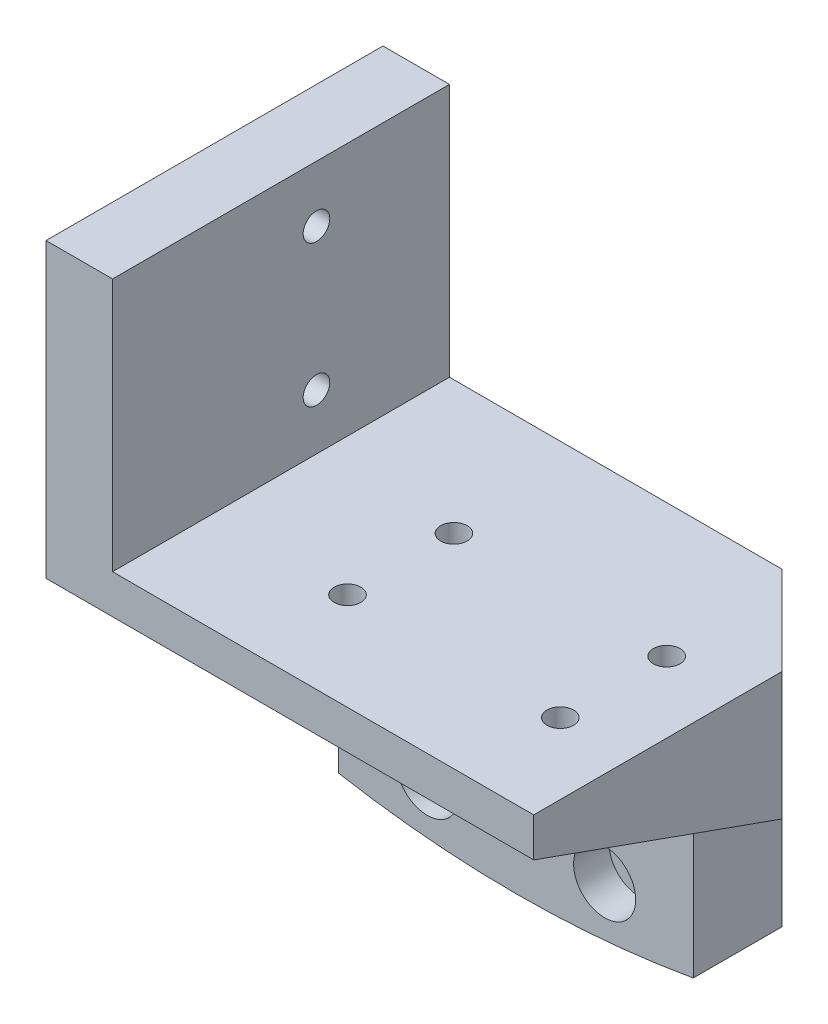
ISO-10303-21;
HEADER;
FILE_DESCRIPTION(('STEP AP214'),'2;1');
FILE_NAME('part.step','',(''),(''),'','','');
FILE_SCHEMA(('AUTOMOTIVE_DESIGN { 1 0 10303 214 1 1 1 1 }'));
ENDSEC;
DATA;
#1=APPLICATION_CONTEXT('core data for automotive mechanical design processes');
#2=APPLICATION_PROTOCOL_DEFINITION('international standard','automotive_design',2000,#1);
#3=PRODUCT_CONTEXT('',#1,'mechanical');
#4=PRODUCT('Part','Part','',(#3));
#5=PRODUCT_RELATED_PRODUCT_CATEGORY('part','',(#4));
#6=PRODUCT_DEFINITION_FORMATION('','',#4);
#7=PRODUCT_DEFINITION_CONTEXT('part definition',#1,'design');
#8=PRODUCT_DEFINITION('design','',#6,#7);
#9=PRODUCT_DEFINITION_SHAPE('','',#8);
#10=(LENGTH_UNIT() NAMED_UNIT(*) SI_UNIT(.MILLI.,.METRE.));
#11=(NAMED_UNIT(*) PLANE_ANGLE_UNIT() SI_UNIT($,.RADIAN.));
#12=(NAMED_UNIT(*) SI_UNIT($,.STERADIAN.) SOLID_ANGLE_UNIT());
#13=UNCERTAINTY_MEASURE_WITH_UNIT(LENGTH_MEASURE(1.E-05),#10,'distance_accuracy_value','');
#14=(GEOMETRIC_REPRESENTATION_CONTEXT(3) GLOBAL_UNCERTAINTY_ASSIGNED_CONTEXT((#13)) GLOBAL_UNIT_ASSIGNED_CONTEXT((#10,
#11,#12)) REPRESENTATION_CONTEXT('',''));
#15=CARTESIAN_POINT('',(0.,0.,0.));
#16=DIRECTION('',(0.,0.,1.));
#17=DIRECTION('',(1.,0.,0.));
#18=AXIS2_PLACEMENT_3D('',#15,#16,#17);
#19=CARTESIAN_POINT('',(-20.,-112.231902772786,10.));
#20=DIRECTION('',(1.,0.,0.));
#21=DIRECTION('',(0.,1.,0.));
#22=AXIS2_PLACEMENT_3D('',#19,#20,#21);
#23=PLANE('',#22);
#24=DIRECTION('',(0.,-1.,0.));
#25=VECTOR('',#24,1.);
#26=CARTESIAN_POINT('',(-20.,-112.231902772786,10.));
#27=LINE('',#26,#25);
#28=CARTESIAN_POINT('',(-20.,-96.7,10.));
#29=VERTEX_POINT('',#28);
#30=CARTESIAN_POINT('',(-20.,-112.231902772786,10.));
#31=VERTEX_POINT('',#30);
#32=EDGE_CURVE('E211',#29,#31,#27,.T.);
#33=ORIENTED_EDGE('',*,*,#32,.F.);
#34=DIRECTION('',(0.,0.,-1.));
#35=VECTOR('',#34,1.);
#36=CARTESIAN_POINT('',(-20.,-96.7,0.));
#37=LINE('',#36,#35);
#38=CARTESIAN_POINT('',(-20.,-96.7,0.));
#39=VERTEX_POINT('',#38);
#40=EDGE_CURVE('E268',#29,#39,#37,.T.);
#41=ORIENTED_EDGE('',*,*,#40,.T.);
#42=DIRECTION('',(0.,-1.,0.));
#43=VECTOR('',#42,1.);
#44=CARTESIAN_POINT('',(-20.,-112.231902772786,0.));
#45=LINE('',#44,#43);
#46=CARTESIAN_POINT('',(-20.,-112.231902772786,0.));
#47=VERTEX_POINT('',#46);
#48=EDGE_CURVE('E206',#39,#47,#45,.T.);
#49=ORIENTED_EDGE('',*,*,#48,.T.);
#50=DIRECTION('',(0.,0.,-1.));
#51=VECTOR('',#50,1.);
#52=CARTESIAN_POINT('',(-20.,-112.231902772786,10.));
#53=LINE('',#52,#51);
#54=EDGE_CURVE('E213',#31,#47,#53,.T.);
#55=ORIENTED_EDGE('',*,*,#54,.F.);
#56=EDGE_LOOP('',(#33,#41,#49,#55));
#57=FACE_BOUND('',#56,.T.);
#58=ADVANCED_FACE('F43',(#57),#23,.F.);
#59=CARTESIAN_POINT('',(-9.99999999999998,-97.85,-0.000999999999999265));
#60=DIRECTION('',(0.,0.,1.));
#61=DIRECTION('',(1.,0.,0.));
#62=AXIS2_PLACEMENT_3D('',#59,#60,#61);
#63=CYLINDRICAL_SURFACE('',#62,1.75);
#64=CARTESIAN_POINT('',(-9.99999999999998,-97.85,0.));
#65=DIRECTION('',(0.,0.,-1.));
#66=DIRECTION('',(-1.,0.,0.));
#67=AXIS2_PLACEMENT_3D('',#64,#65,#66);
#68=CIRCLE('',#67,1.75);
#69=CARTESIAN_POINT('',(-11.75,-97.85,0.));
#70=VERTEX_POINT('',#69);
#71=EDGE_CURVE('E196',#70,#70,#68,.F.);
#72=ORIENTED_EDGE('',*,*,#71,.F.);
#73=EDGE_LOOP('',(#72));
#74=FACE_BOUND('',#73,.T.);
#75=CARTESIAN_POINT('',(-9.99999999999998,-97.85,6.));
#76=DIRECTION('',(0.,0.,1.));
#77=DIRECTION('',(1.,0.,0.));
#78=AXIS2_PLACEMENT_3D('',#75,#76,#77);
#79=CIRCLE('',#78,1.75);
#80=CARTESIAN_POINT('',(-8.24999999999998,-97.85,6.));
#81=VERTEX_POINT('',#80);
#82=EDGE_CURVE('E192',#81,#81,#79,.F.);
#83=ORIENTED_EDGE('',*,*,#82,.F.);
#84=EDGE_LOOP('',(#83));
#85=FACE_BOUND('',#84,.T.);
#86=ADVANCED_FACE('F364',(#74,#85),#63,.F.);
#87=CARTESIAN_POINT('',(10.,-107.85,-0.000999999999999265));
#88=DIRECTION('',(0.,0.,1.));
#89=DIRECTION('',(1.,0.,0.));
#90=AXIS2_PLACEMENT_3D('',#87,#88,#89);
#91=CYLINDRICAL_SURFACE('',#90,1.75);
#92=CARTESIAN_POINT('',(10.,-107.85,0.));
#93=DIRECTION('',(0.,0.,-1.));
#94=DIRECTION('',(-1.,0.,0.));
#95=AXIS2_PLACEMENT_3D('',#92,#93,#94);
#96=CIRCLE('',#95,1.75);
#97=CARTESIAN_POINT('',(8.25000000000002,-107.85,0.));
#98=VERTEX_POINT('',#97);
#99=EDGE_CURVE('E188',#98,#98,#96,.F.);
#100=ORIENTED_EDGE('',*,*,#99,.F.);
#101=EDGE_LOOP('',(#100));
#102=FACE_BOUND('',#101,.T.);
#103=CARTESIAN_POINT('',(10.,-107.85,6.));
#104=DIRECTION('',(0.,0.,1.));
#105=DIRECTION('',(1.,0.,0.));
#106=AXIS2_PLACEMENT_3D('',#103,#104,#105);
#107=CIRCLE('',#106,1.75);
#108=CARTESIAN_POINT('',(11.75,-107.85,6.));
#109=VERTEX_POINT('',#108);
#110=EDGE_CURVE('E234',#109,#109,#107,.F.);
#111=ORIENTED_EDGE('',*,*,#110,.F.);
#112=EDGE_LOOP('',(#111));
#113=FACE_BOUND('',#112,.T.);
#114=ADVANCED_FACE('F370',(#102,#113),#91,.F.);
#115=CARTESIAN_POINT('',(9.99999999999999,-97.85,-0.000999999999999265));
#116=DIRECTION('',(0.,0.,1.));
#117=DIRECTION('',(1.,0.,0.));
#118=AXIS2_PLACEMENT_3D('',#115,#116,#117);
#119=CYLINDRICAL_SURFACE('',#118,1.75);
#120=CARTESIAN_POINT('',(9.99999999999999,-97.85,0.));
#121=DIRECTION('',(0.,0.,-1.));
#122=DIRECTION('',(-1.,0.,0.));
#123=AXIS2_PLACEMENT_3D('',#120,#121,#122);
#124=CIRCLE('',#123,1.75);
#125=CARTESIAN_POINT('',(8.24999999999999,-97.85,0.));
#126=VERTEX_POINT('',#125);
#127=EDGE_CURVE('E191',#126,#126,#124,.F.);
#128=ORIENTED_EDGE('',*,*,#127,.F.);
#129=EDGE_LOOP('',(#128));
#130=FACE_BOUND('',#129,.T.);
#131=CARTESIAN_POINT('',(9.99999999999999,-97.85,6.));
#132=DIRECTION('',(0.,0.,1.));
#133=DIRECTION('',(1.,0.,0.));
#134=AXIS2_PLACEMENT_3D('',#131,#132,#133);
#135=CIRCLE('',#134,1.75);
#136=CARTESIAN_POINT('',(11.75,-97.85,6.));
#137=VERTEX_POINT('',#136);
#138=EDGE_CURVE('E231',#137,#137,#135,.F.);
#139=ORIENTED_EDGE('',*,*,#138,.F.);
#140=EDGE_LOOP('',(#139));
#141=FACE_BOUND('',#140,.T.);
#142=ADVANCED_FACE('F508',(#130,#141),#119,.F.);
#143=CARTESIAN_POINT('',(-9.99999999999998,-107.85,-0.000999999999999265));
#144=DIRECTION('',(0.,0.,1.));
#145=DIRECTION('',(1.,0.,0.));
#146=AXIS2_PLACEMENT_3D('',#143,#144,#145);
#147=CYLINDRICAL_SURFACE('',#146,1.75);
#148=CARTESIAN_POINT('',(-9.99999999999998,-107.85,0.));
#149=DIRECTION('',(0.,0.,-1.));
#150=DIRECTION('',(-1.,0.,0.));
#151=AXIS2_PLACEMENT_3D('',#148,#149,#150);
#152=CIRCLE('',#151,1.75);
#153=CARTESIAN_POINT('',(-11.75,-107.85,0.));
#154=VERTEX_POINT('',#153);
#155=EDGE_CURVE('E193',#154,#154,#152,.F.);
#156=ORIENTED_EDGE('',*,*,#155,.F.);
#157=EDGE_LOOP('',(#156));
#158=FACE_BOUND('',#157,.T.);
#159=CARTESIAN_POINT('',(-9.99999999999998,-107.85,6.));
#160=DIRECTION('',(0.,0.,1.));
#161=DIRECTION('',(1.,0.,0.));
#162=AXIS2_PLACEMENT_3D('',#159,#160,#161);
#163=CIRCLE('',#162,1.75);
#164=CARTESIAN_POINT('',(-8.24999999999998,-107.85,6.));
#165=VERTEX_POINT('',#164);
#166=EDGE_CURVE('E185',#165,#165,#163,.F.);
#167=ORIENTED_EDGE('',*,*,#166,.F.);
#168=EDGE_LOOP('',(#167));
#169=FACE_BOUND('',#168,.T.);
#170=ADVANCED_FACE('F385',(#158,#169),#147,.F.);
#171=CARTESIAN_POINT('',(0.,0.,10.));
#172=DIRECTION('',(0.,0.,-1.));
#173=DIRECTION('',(-1.,0.,0.));
#174=AXIS2_PLACEMENT_3D('',#171,#172,#173);
#175=CYLINDRICAL_SURFACE('',#174,114.);
#176=CARTESIAN_POINT('',(0.,0.,0.));
#177=DIRECTION('',(0.,0.,1.));
#178=DIRECTION('',(-1.,0.,0.));
#179=AXIS2_PLACEMENT_3D('',#176,#177,#178);
#180=CIRCLE('',#179,114.);
#181=CARTESIAN_POINT('',(20.,-112.231902772786,0.));
#182=VERTEX_POINT('',#181);
#183=EDGE_CURVE('E201',#47,#182,#180,.T.);
#184=ORIENTED_EDGE('',*,*,#183,.T.);
#185=DIRECTION('',(0.,0.,-1.));
#186=VECTOR('',#185,1.);
#187=CARTESIAN_POINT('',(20.,-112.231902772786,10.));
#188=LINE('',#187,#186);
#189=CARTESIAN_POINT('',(20.,-112.231902772786,10.));
#190=VERTEX_POINT('',#189);
#191=EDGE_CURVE('E225',#190,#182,#188,.T.);
#192=ORIENTED_EDGE('',*,*,#191,.F.);
#193=CARTESIAN_POINT('',(0.,0.,10.));
#194=DIRECTION('',(0.,0.,1.));
#195=DIRECTION('',(-1.,0.,0.));
#196=AXIS2_PLACEMENT_3D('',#193,#194,#195);
#197=CIRCLE('',#196,114.);
#198=EDGE_CURVE('E202',#31,#190,#197,.T.);
#199=ORIENTED_EDGE('',*,*,#198,.F.);
#200=ORIENTED_EDGE('',*,*,#54,.T.);
#201=EDGE_LOOP('',(#184,#192,#199,#200));
#202=FACE_BOUND('',#201,.T.);
#203=ADVANCED_FACE('F381',(#202),#175,.T.);
#204=CARTESIAN_POINT('',(20.,-91.7,10.));
#205=DIRECTION('',(-1.,0.,0.));
#206=DIRECTION('',(0.,-1.,0.));
#207=AXIS2_PLACEMENT_3D('',#204,#205,#206);
#208=PLANE('',#207);
#209=DIRECTION('',(0.,1.,0.));
#210=VECTOR('',#209,1.);
#211=CARTESIAN_POINT('',(20.,-91.7,0.));
#212=LINE('',#211,#210);
#213=CARTESIAN_POINT('',(20.,-91.7,0.));
#214=VERTEX_POINT('',#213);
#215=EDGE_CURVE('E216',#182,#214,#212,.T.);
#216=ORIENTED_EDGE('',*,*,#215,.T.);
#217=DIRECTION('',(0.,0.,-1.));
#218=VECTOR('',#217,1.);
#219=CARTESIAN_POINT('',(20.,-91.7,10.));
#220=LINE('',#219,#218);
#221=CARTESIAN_POINT('',(20.,-91.7,10.));
#222=VERTEX_POINT('',#221);
#223=EDGE_CURVE('E222',#222,#214,#220,.T.);
#224=ORIENTED_EDGE('',*,*,#223,.F.);
#225=DIRECTION('',(0.,1.,0.));
#226=VECTOR('',#225,1.);
#227=CARTESIAN_POINT('',(20.,-91.7,10.));
#228=LINE('',#227,#226);
#229=EDGE_CURVE('E205',#190,#222,#228,.T.);
#230=ORIENTED_EDGE('',*,*,#229,.F.);
#231=ORIENTED_EDGE('',*,*,#191,.T.);
#232=EDGE_LOOP('',(#216,#224,#230,#231));
#233=FACE_BOUND('',#232,.T.);
#234=ADVANCED_FACE('F377',(#233),#208,.F.);
#235=CARTESIAN_POINT('',(0.,0.,10.));
#236=DIRECTION('',(0.,0.,-1.));
#237=DIRECTION('',(-1.,0.,0.));
#238=AXIS2_PLACEMENT_3D('',#235,#236,#237);
#239=PLANE('',#238);
#240=CARTESIAN_POINT('',(-9.99999999999998,-107.85,10.));
#241=DIRECTION('',(0.,0.,1.));
#242=DIRECTION('',(1.,0.,0.));
#243=AXIS2_PLACEMENT_3D('',#240,#241,#242);
#244=CIRCLE('',#243,3.5);
#245=CARTESIAN_POINT('',(-6.49999999999998,-107.85,10.));
#246=VERTEX_POINT('',#245);
#247=EDGE_CURVE('E163',#246,#246,#244,.T.);
#248=ORIENTED_EDGE('',*,*,#247,.F.);
#249=EDGE_LOOP('',(#248));
#250=FACE_BOUND('',#249,.T.);
#251=CARTESIAN_POINT('',(10.,-107.85,10.));
#252=DIRECTION('',(0.,0.,1.));
#253=DIRECTION('',(1.,0.,0.));
#254=AXIS2_PLACEMENT_3D('',#251,#252,#253);
#255=CIRCLE('',#254,3.5);
#256=CARTESIAN_POINT('',(13.5,-107.85,10.));
#257=VERTEX_POINT('',#256);
#258=EDGE_CURVE('E174',#257,#257,#255,.T.);
#259=ORIENTED_EDGE('',*,*,#258,.F.);
#260=EDGE_LOOP('',(#259));
#261=FACE_BOUND('',#260,.T.);
#262=CARTESIAN_POINT('',(9.99999999999999,-97.85,10.));
#263=DIRECTION('',(0.,0.,1.));
#264=DIRECTION('',(1.,0.,0.));
#265=AXIS2_PLACEMENT_3D('',#262,#263,#264);
#266=CIRCLE('',#265,3.5);
#267=CARTESIAN_POINT('',(13.5,-97.85,10.));
#268=VERTEX_POINT('',#267);
#269=EDGE_CURVE('E168',#268,#268,#266,.T.);
#270=ORIENTED_EDGE('',*,*,#269,.F.);
#271=EDGE_LOOP('',(#270));
#272=FACE_BOUND('',#271,.T.);
#273=CARTESIAN_POINT('',(-9.99999999999998,-97.85,10.));
#274=DIRECTION('',(0.,0.,1.));
#275=DIRECTION('',(1.,0.,0.));
#276=AXIS2_PLACEMENT_3D('',#273,#274,#275);
#277=CIRCLE('',#276,3.5);
#278=CARTESIAN_POINT('',(-6.49999999999998,-97.85,10.));
#279=VERTEX_POINT('',#278);
#280=EDGE_CURVE('E167',#279,#279,#277,.T.);
#281=ORIENTED_EDGE('',*,*,#280,.F.);
#282=EDGE_LOOP('',(#281));
#283=FACE_BOUND('',#282,.T.);
#284=ORIENTED_EDGE('',*,*,#198,.T.);
#285=ORIENTED_EDGE('',*,*,#229,.T.);
#286=DIRECTION('',(-1.,0.,0.));
#287=VECTOR('',#286,1.);
#288=CARTESIAN_POINT('',(-20.,-91.7,10.));
#289=LINE('',#288,#287);
#290=CARTESIAN_POINT('',(-25.,-91.7,10.));
#291=VERTEX_POINT('',#290);
#292=EDGE_CURVE('E209',#222,#291,#289,.T.);
#293=ORIENTED_EDGE('',*,*,#292,.T.);
#294=DIRECTION('',(-0.70710678118655,0.707106781186545,0.));
#295=VECTOR('',#294,1.);
#296=CARTESIAN_POINT('',(-58.3499999999999,-58.3500000000004,10.));
#297=LINE('',#296,#295);
#298=EDGE_CURVE('E54',#291,#29,#297,.F.);
#299=ORIENTED_EDGE('',*,*,#298,.T.);
#300=ORIENTED_EDGE('',*,*,#32,.T.);
#301=EDGE_LOOP('',(#284,#285,#293,#299,#300));
#302=FACE_BOUND('',#301,.T.);
#303=ADVANCED_FACE('F380',(#250,#261,#272,#283,#302),#239,.F.);
#304=CARTESIAN_POINT('',(0.,0.,0.));
#305=DIRECTION('',(0.,0.,-1.));
#306=DIRECTION('',(-1.,0.,0.));
#307=AXIS2_PLACEMENT_3D('',#304,#305,#306);
#308=PLANE('',#307);
#309=ORIENTED_EDGE('',*,*,#155,.T.);
#310=EDGE_LOOP('',(#309));
#311=FACE_BOUND('',#310,.T.);
#312=ORIENTED_EDGE('',*,*,#127,.T.);
#313=EDGE_LOOP('',(#312));
#314=FACE_BOUND('',#313,.T.);
#315=ORIENTED_EDGE('',*,*,#99,.T.);
#316=EDGE_LOOP('',(#315));
#317=FACE_BOUND('',#316,.T.);
#318=ORIENTED_EDGE('',*,*,#71,.T.);
#319=EDGE_LOOP('',(#318));
#320=FACE_BOUND('',#319,.T.);
#321=DIRECTION('',(-1.,0.,0.));
#322=VECTOR('',#321,1.);
#323=CARTESIAN_POINT('',(-20.,-77.3,0.));
#324=LINE('',#323,#322);
#325=CARTESIAN_POINT('',(20.,-77.3,0.));
#326=VERTEX_POINT('',#325);
#327=CARTESIAN_POINT('',(-17.5,-77.3,0.));
#328=VERTEX_POINT('',#327);
#329=EDGE_CURVE('E144',#326,#328,#324,.T.);
#330=ORIENTED_EDGE('',*,*,#329,.F.);
#331=DIRECTION('',(0.,-1.,0.));
#332=VECTOR('',#331,1.);
#333=CARTESIAN_POINT('',(20.,-91.7,0.));
#334=LINE('',#333,#332);
#335=EDGE_CURVE('E228',#326,#214,#334,.T.);
#336=ORIENTED_EDGE('',*,*,#335,.T.);
#337=ORIENTED_EDGE('',*,*,#215,.F.);
#338=ORIENTED_EDGE('',*,*,#183,.F.);
#339=ORIENTED_EDGE('',*,*,#48,.F.);
#340=DIRECTION('',(0.70710678118655,-0.707106781186545,0.));
#341=VECTOR('',#340,1.);
#342=CARTESIAN_POINT('',(-25.,-91.7,0.));
#343=LINE('',#342,#341);
#344=CARTESIAN_POINT('',(-25.,-91.7,0.));
#345=VERTEX_POINT('',#344);
#346=EDGE_CURVE('E12',#39,#345,#343,.F.);
#347=ORIENTED_EDGE('',*,*,#346,.T.);
#348=DIRECTION('',(0.,-1.,0.));
#349=VECTOR('',#348,1.);
#350=CARTESIAN_POINT('',(-25.,-91.7,0.));
#351=LINE('',#350,#349);
#352=CARTESIAN_POINT('',(-25.,-48.7,0.));
#353=VERTEX_POINT('',#352);
#354=EDGE_CURVE('E320',#353,#345,#351,.T.);
#355=ORIENTED_EDGE('',*,*,#354,.F.);
#356=DIRECTION('',(1.,0.,0.));
#357=VECTOR('',#356,1.);
#358=CARTESIAN_POINT('',(-25.,-48.7,0.));
#359=LINE('',#358,#357);
#360=CARTESIAN_POINT('',(-17.5,-48.7,0.));
#361=VERTEX_POINT('',#360);
#362=EDGE_CURVE('E326',#353,#361,#359,.T.);
#363=ORIENTED_EDGE('',*,*,#362,.T.);
#364=DIRECTION('',(0.,1.,0.));
#365=VECTOR('',#364,1.);
#366=CARTESIAN_POINT('',(-17.5,-77.3,0.));
#367=LINE('',#366,#365);
#368=EDGE_CURVE('E145',#328,#361,#367,.T.);
#369=ORIENTED_EDGE('',*,*,#368,.F.);
#370=EDGE_LOOP('',(#330,#336,#337,#338,#339,#347,#355,#363,#369));
#371=FACE_BOUND('',#370,.T.);
#372=ADVANCED_FACE('F375',(#311,#314,#317,#320,#371),#308,.T.);
#373=CARTESIAN_POINT('',(-9.99999999999998,-107.85,6.));
#374=DIRECTION('',(0.,0.,1.));
#375=DIRECTION('',(1.,0.,0.));
#376=AXIS2_PLACEMENT_3D('',#373,#374,#375);
#377=PLANE('',#376);
#378=CARTESIAN_POINT('',(-9.99999999999998,-107.85,6.));
#379=DIRECTION('',(0.,0.,1.));
#380=DIRECTION('',(1.,0.,0.));
#381=AXIS2_PLACEMENT_3D('',#378,#379,#380);
#382=CIRCLE('',#381,3.5);
#383=CARTESIAN_POINT('',(-6.49999999999998,-107.85,6.));
#384=VERTEX_POINT('',#383);
#385=EDGE_CURVE('E177',#384,#384,#382,.T.);
#386=ORIENTED_EDGE('',*,*,#385,.T.);
#387=EDGE_LOOP('',(#386));
#388=FACE_BOUND('',#387,.T.);
#389=ORIENTED_EDGE('',*,*,#166,.T.);
#390=EDGE_LOOP('',(#389));
#391=FACE_BOUND('',#390,.T.);
#392=ADVANCED_FACE('F493',(#388,#391),#377,.T.);
#393=CARTESIAN_POINT('',(-9.99999999999998,-107.85,6.));
#394=DIRECTION('',(0.,0.,1.));
#395=DIRECTION('',(1.,0.,0.));
#396=AXIS2_PLACEMENT_3D('',#393,#394,#395);
#397=CYLINDRICAL_SURFACE('',#396,3.5);
#398=ORIENTED_EDGE('',*,*,#385,.F.);
#399=EDGE_LOOP('',(#398));
#400=FACE_BOUND('',#399,.T.);
#401=ORIENTED_EDGE('',*,*,#247,.T.);
#402=EDGE_LOOP('',(#401));
#403=FACE_BOUND('',#402,.T.);
#404=ADVANCED_FACE('F479',(#400,#403),#397,.F.);
#405=CARTESIAN_POINT('',(9.99999999999999,-97.85,6.));
#406=DIRECTION('',(0.,0.,1.));
#407=DIRECTION('',(1.,0.,0.));
#408=AXIS2_PLACEMENT_3D('',#405,#406,#407);
#409=PLANE('',#408);
#410=CARTESIAN_POINT('',(9.99999999999999,-97.85,6.));
#411=DIRECTION('',(0.,0.,1.));
#412=DIRECTION('',(1.,0.,0.));
#413=AXIS2_PLACEMENT_3D('',#410,#411,#412);
#414=CIRCLE('',#413,3.5);
#415=CARTESIAN_POINT('',(13.5,-97.85,6.));
#416=VERTEX_POINT('',#415);
#417=EDGE_CURVE('E164',#416,#416,#414,.T.);
#418=ORIENTED_EDGE('',*,*,#417,.T.);
#419=EDGE_LOOP('',(#418));
#420=FACE_BOUND('',#419,.T.);
#421=ORIENTED_EDGE('',*,*,#138,.T.);
#422=EDGE_LOOP('',(#421));
#423=FACE_BOUND('',#422,.T.);
#424=ADVANCED_FACE('F475',(#420,#423),#409,.T.);
#425=CARTESIAN_POINT('',(9.99999999999999,-97.85,6.));
#426=DIRECTION('',(0.,0.,1.));
#427=DIRECTION('',(1.,0.,0.));
#428=AXIS2_PLACEMENT_3D('',#425,#426,#427);
#429=CYLINDRICAL_SURFACE('',#428,3.5);
#430=ORIENTED_EDGE('',*,*,#417,.F.);
#431=EDGE_LOOP('',(#430));
#432=FACE_BOUND('',#431,.T.);
#433=ORIENTED_EDGE('',*,*,#269,.T.);
#434=EDGE_LOOP('',(#433));
#435=FACE_BOUND('',#434,.T.);
#436=ADVANCED_FACE('F478',(#432,#435),#429,.F.);
#437=CARTESIAN_POINT('',(10.,-107.85,6.));
#438=DIRECTION('',(0.,0.,1.));
#439=DIRECTION('',(1.,0.,0.));
#440=AXIS2_PLACEMENT_3D('',#437,#438,#439);
#441=PLANE('',#440);
#442=CARTESIAN_POINT('',(10.,-107.85,6.));
#443=DIRECTION('',(0.,0.,1.));
#444=DIRECTION('',(1.,0.,0.));
#445=AXIS2_PLACEMENT_3D('',#442,#443,#444);
#446=CIRCLE('',#445,3.5);
#447=CARTESIAN_POINT('',(13.5,-107.85,6.));
#448=VERTEX_POINT('',#447);
#449=EDGE_CURVE('E171',#448,#448,#446,.T.);
#450=ORIENTED_EDGE('',*,*,#449,.T.);
#451=EDGE_LOOP('',(#450));
#452=FACE_BOUND('',#451,.T.);
#453=ORIENTED_EDGE('',*,*,#110,.T.);
#454=EDGE_LOOP('',(#453));
#455=FACE_BOUND('',#454,.T.);
#456=ADVANCED_FACE('F483',(#452,#455),#441,.T.);
#457=CARTESIAN_POINT('',(10.,-107.85,6.));
#458=DIRECTION('',(0.,0.,1.));
#459=DIRECTION('',(1.,0.,0.));
#460=AXIS2_PLACEMENT_3D('',#457,#458,#459);
#461=CYLINDRICAL_SURFACE('',#460,3.5);
#462=ORIENTED_EDGE('',*,*,#449,.F.);
#463=EDGE_LOOP('',(#462));
#464=FACE_BOUND('',#463,.T.);
#465=ORIENTED_EDGE('',*,*,#258,.T.);
#466=EDGE_LOOP('',(#465));
#467=FACE_BOUND('',#466,.T.);
#468=ADVANCED_FACE('F487',(#464,#467),#461,.F.);
#469=CARTESIAN_POINT('',(-9.99999999999998,-97.85,6.));
#470=DIRECTION('',(0.,0.,1.));
#471=DIRECTION('',(1.,0.,0.));
#472=AXIS2_PLACEMENT_3D('',#469,#470,#471);
#473=PLANE('',#472);
#474=CARTESIAN_POINT('',(-9.99999999999998,-97.85,6.));
#475=DIRECTION('',(0.,0.,1.));
#476=DIRECTION('',(1.,0.,0.));
#477=AXIS2_PLACEMENT_3D('',#474,#475,#476);
#478=CIRCLE('',#477,3.5);
#479=CARTESIAN_POINT('',(-6.49999999999998,-97.85,6.));
#480=VERTEX_POINT('',#479);
#481=EDGE_CURVE('E182',#480,#480,#478,.T.);
#482=ORIENTED_EDGE('',*,*,#481,.T.);
#483=EDGE_LOOP('',(#482));
#484=FACE_BOUND('',#483,.T.);
#485=ORIENTED_EDGE('',*,*,#82,.T.);
#486=EDGE_LOOP('',(#485));
#487=FACE_BOUND('',#486,.T.);
#488=ADVANCED_FACE('F491',(#484,#487),#473,.T.);
#489=CARTESIAN_POINT('',(-9.99999999999998,-97.85,6.));
#490=DIRECTION('',(0.,0.,1.));
#491=DIRECTION('',(1.,0.,0.));
#492=AXIS2_PLACEMENT_3D('',#489,#490,#491);
#493=CYLINDRICAL_SURFACE('',#492,3.5);
#494=ORIENTED_EDGE('',*,*,#481,.F.);
#495=EDGE_LOOP('',(#494));
#496=FACE_BOUND('',#495,.T.);
#497=ORIENTED_EDGE('',*,*,#280,.T.);
#498=EDGE_LOOP('',(#497));
#499=FACE_BOUND('',#498,.T.);
#500=ADVANCED_FACE('F474',(#496,#499),#493,.F.);
#501=CARTESIAN_POINT('',(-20.,-77.3,38.));
#502=DIRECTION('',(0.,0.,-1.));
#503=DIRECTION('',(-1.,0.,0.));
#504=AXIS2_PLACEMENT_3D('',#501,#502,#503);
#505=PLANE('',#504);
#506=DIRECTION('',(1.,0.,0.));
#507=VECTOR('',#506,1.);
#508=CARTESIAN_POINT('',(-20.,-77.3,38.));
#509=LINE('',#508,#507);
#510=CARTESIAN_POINT('',(-17.5,-77.3,38.));
#511=VERTEX_POINT('',#510);
#512=CARTESIAN_POINT('',(30.,-77.3,38.));
#513=VERTEX_POINT('',#512);
#514=EDGE_CURVE('E141',#511,#513,#509,.T.);
#515=ORIENTED_EDGE('',*,*,#514,.F.);
#516=DIRECTION('',(0.,-1.,0.));
#517=VECTOR('',#516,1.);
#518=CARTESIAN_POINT('',(-17.5,-48.7,38.));
#519=LINE('',#518,#517);
#520=CARTESIAN_POINT('',(-17.5,-48.7,38.));
#521=VERTEX_POINT('',#520);
#522=EDGE_CURVE('E123',#521,#511,#519,.T.);
#523=ORIENTED_EDGE('',*,*,#522,.F.);
#524=DIRECTION('',(1.,0.,0.));
#525=VECTOR('',#524,1.);
#526=CARTESIAN_POINT('',(-25.,-48.7,38.));
#527=LINE('',#526,#525);
#528=CARTESIAN_POINT('',(-25.,-48.7,38.));
#529=VERTEX_POINT('',#528);
#530=EDGE_CURVE('E284',#529,#521,#527,.T.);
#531=ORIENTED_EDGE('',*,*,#530,.F.);
#532=DIRECTION('',(0.,1.,0.));
#533=VECTOR('',#532,1.);
#534=CARTESIAN_POINT('',(-25.,-48.7,38.));
#535=LINE('',#534,#533);
#536=CARTESIAN_POINT('',(-25.,-81.7,38.));
#537=VERTEX_POINT('',#536);
#538=EDGE_CURVE('E316',#537,#529,#535,.T.);
#539=ORIENTED_EDGE('',*,*,#538,.F.);
#540=DIRECTION('',(1.,0.,0.));
#541=VECTOR('',#540,1.);
#542=CARTESIAN_POINT('',(-20.,-81.7,38.));
#543=LINE('',#542,#541);
#544=CARTESIAN_POINT('',(30.,-81.7,38.));
#545=VERTEX_POINT('',#544);
#546=EDGE_CURVE('E262',#537,#545,#543,.T.);
#547=ORIENTED_EDGE('',*,*,#546,.T.);
#548=DIRECTION('',(0.,-1.,0.));
#549=VECTOR('',#548,1.);
#550=CARTESIAN_POINT('',(30.,-77.3,38.));
#551=LINE('',#550,#549);
#552=EDGE_CURVE('E150',#513,#545,#551,.T.);
#553=ORIENTED_EDGE('',*,*,#552,.F.);
#554=EDGE_LOOP('',(#515,#523,#531,#539,#547,#553));
#555=FACE_BOUND('',#554,.T.);
#556=ADVANCED_FACE('F147',(#555),#505,.F.);
#557=CARTESIAN_POINT('',(30.,-77.3,0.));
#558=DIRECTION('',(-1.,0.,0.));
#559=DIRECTION('',(0.,0.,1.));
#560=AXIS2_PLACEMENT_3D('',#557,#558,#559);
#561=PLANE('',#560);
#562=ORIENTED_EDGE('',*,*,#552,.T.);
#563=DIRECTION('',(0.,0.336336396998154,0.941741911594839));
#564=VECTOR('',#563,1.);
#565=CARTESIAN_POINT('',(30.,-81.7,38.));
#566=LINE('',#565,#564);
#567=CARTESIAN_POINT('',(30.,-91.7,10.));
#568=VERTEX_POINT('',#567);
#569=EDGE_CURVE('E264',#545,#568,#566,.F.);
#570=ORIENTED_EDGE('',*,*,#569,.T.);
#571=DIRECTION('',(0.,1.,0.));
#572=VECTOR('',#571,1.);
#573=CARTESIAN_POINT('',(30.,-77.3,10.));
#574=LINE('',#573,#572);
#575=CARTESIAN_POINT('',(30.,-77.3,10.));
#576=VERTEX_POINT('',#575);
#577=EDGE_CURVE('E258',#568,#576,#574,.T.);
#578=ORIENTED_EDGE('',*,*,#577,.T.);
#579=DIRECTION('',(0.,0.,-1.));
#580=VECTOR('',#579,1.);
#581=CARTESIAN_POINT('',(30.,-77.3,0.));
#582=LINE('',#581,#580);
#583=EDGE_CURVE('E152',#513,#576,#582,.T.);
#584=ORIENTED_EDGE('',*,*,#583,.F.);
#585=EDGE_LOOP('',(#562,#570,#578,#584));
#586=FACE_BOUND('',#585,.T.);
#587=ADVANCED_FACE('F461',(#586),#561,.F.);
#588=CARTESIAN_POINT('',(0.,-77.3,0.));
#589=DIRECTION('',(0.,1.,0.));
#590=DIRECTION('',(0.,0.,1.));
#591=AXIS2_PLACEMENT_3D('',#588,#589,#590);
#592=PLANE('',#591);
#593=DIRECTION('',(0.,0.,-1.));
#594=VECTOR('',#593,1.);
#595=CARTESIAN_POINT('',(-17.5,-77.3,38.));
#596=LINE('',#595,#594);
#597=EDGE_CURVE('E127',#511,#328,#596,.T.);
#598=ORIENTED_EDGE('',*,*,#597,.F.);
#599=ORIENTED_EDGE('',*,*,#514,.T.);
#600=ORIENTED_EDGE('',*,*,#583,.T.);
#601=DIRECTION('',(-0.707106781186546,0.,-0.707106781186549));
#602=VECTOR('',#601,1.);
#603=CARTESIAN_POINT('',(10.,-77.3,-10.));
#604=LINE('',#603,#602);
#605=EDGE_CURVE('E260',#576,#326,#604,.T.);
#606=ORIENTED_EDGE('',*,*,#605,.T.);
#607=ORIENTED_EDGE('',*,*,#329,.T.);
#608=EDGE_LOOP('',(#598,#599,#600,#606,#607));
#609=FACE_BOUND('',#608,.T.);
#610=CARTESIAN_POINT('',(22.,-77.3,27.));
#611=DIRECTION('',(0.,1.,0.));
#612=DIRECTION('',(0.,0.,1.));
#613=AXIS2_PLACEMENT_3D('',#610,#611,#612);
#614=CIRCLE('',#613,1.5);
#615=CARTESIAN_POINT('',(22.,-77.3,28.5));
#616=VERTEX_POINT('',#615);
#617=EDGE_CURVE('E157',#616,#616,#614,.F.);
#618=ORIENTED_EDGE('',*,*,#617,.T.);
#619=EDGE_LOOP('',(#618));
#620=FACE_BOUND('',#619,.T.);
#621=CARTESIAN_POINT('',(-2.,-77.3,15.));
#622=DIRECTION('',(0.,1.,0.));
#623=DIRECTION('',(0.,0.,1.));
#624=AXIS2_PLACEMENT_3D('',#621,#622,#623);
#625=CIRCLE('',#624,1.5);
#626=CARTESIAN_POINT('',(-2.,-77.3,16.5));
#627=VERTEX_POINT('',#626);
#628=EDGE_CURVE('E339',#627,#627,#625,.F.);
#629=ORIENTED_EDGE('',*,*,#628,.T.);
#630=EDGE_LOOP('',(#629));
#631=FACE_BOUND('',#630,.T.);
#632=CARTESIAN_POINT('',(22.,-77.3,15.));
#633=DIRECTION('',(0.,1.,0.));
#634=DIRECTION('',(0.,0.,1.));
#635=AXIS2_PLACEMENT_3D('',#632,#633,#634);
#636=CIRCLE('',#635,1.5);
#637=CARTESIAN_POINT('',(22.,-77.3,16.5));
#638=VERTEX_POINT('',#637);
#639=EDGE_CURVE('E252',#638,#638,#636,.F.);
#640=ORIENTED_EDGE('',*,*,#639,.T.);
#641=EDGE_LOOP('',(#640));
#642=FACE_BOUND('',#641,.T.);
#643=CARTESIAN_POINT('',(-2.,-77.3,27.));
#644=DIRECTION('',(0.,1.,0.));
#645=DIRECTION('',(0.,0.,1.));
#646=AXIS2_PLACEMENT_3D('',#643,#644,#645);
#647=CIRCLE('',#646,1.5);
#648=CARTESIAN_POINT('',(-2.,-77.3,28.5));
#649=VERTEX_POINT('',#648);
#650=EDGE_CURVE('E153',#649,#649,#647,.F.);
#651=ORIENTED_EDGE('',*,*,#650,.T.);
#652=EDGE_LOOP('',(#651));
#653=FACE_BOUND('',#652,.T.);
#654=ADVANCED_FACE('F138',(#609,#620,#631,#642,#653),#592,.T.);
#655=CARTESIAN_POINT('',(0.,-91.7,0.));
#656=DIRECTION('',(0.,1.,0.));
#657=DIRECTION('',(0.,0.,1.));
#658=AXIS2_PLACEMENT_3D('',#655,#656,#657);
#659=PLANE('',#658);
#660=DIRECTION('',(0.707106781186546,0.,0.707106781186549));
#661=VECTOR('',#660,1.);
#662=CARTESIAN_POINT('',(20.,-91.7,0.));
#663=LINE('',#662,#661);
#664=EDGE_CURVE('E255',#214,#568,#663,.T.);
#665=ORIENTED_EDGE('',*,*,#664,.T.);
#666=DIRECTION('',(-1.,0.,0.));
#667=VECTOR('',#666,1.);
#668=CARTESIAN_POINT('',(0.,-91.7,9.99999999999973));
#669=LINE('',#668,#667);
#670=EDGE_CURVE('E266',#568,#222,#669,.T.);
#671=ORIENTED_EDGE('',*,*,#670,.T.);
#672=ORIENTED_EDGE('',*,*,#223,.T.);
#673=EDGE_LOOP('',(#665,#671,#672));
#674=FACE_BOUND('',#673,.T.);
#675=ADVANCED_FACE('F457',(#674),#659,.F.);
#676=CARTESIAN_POINT('',(-2.,-77.299,27.));
#677=DIRECTION('',(0.,-1.,0.));
#678=DIRECTION('',(0.,0.,-1.));
#679=AXIS2_PLACEMENT_3D('',#676,#677,#678);
#680=CYLINDRICAL_SURFACE('',#679,1.5);
#681=CARTESIAN_POINT('',(-2.,-82.3,27.));
#682=DIRECTION('',(0.,1.,0.));
#683=DIRECTION('',(0.,0.,1.));
#684=AXIS2_PLACEMENT_3D('',#681,#682,#683);
#685=CIRCLE('',#684,1.5);
#686=CARTESIAN_POINT('',(-2.,-82.3,28.5));
#687=VERTEX_POINT('',#686);
#688=EDGE_CURVE('E249',#687,#687,#685,.F.);
#689=ORIENTED_EDGE('',*,*,#688,.T.);
#690=EDGE_LOOP('',(#689));
#691=FACE_BOUND('',#690,.T.);
#692=ORIENTED_EDGE('',*,*,#650,.F.);
#693=EDGE_LOOP('',(#692));
#694=FACE_BOUND('',#693,.T.);
#695=ADVANCED_FACE('F359',(#691,#694),#680,.F.);
#696=CARTESIAN_POINT('',(22.,-77.299,15.));
#697=DIRECTION('',(0.,-1.,0.));
#698=DIRECTION('',(0.,0.,-1.));
#699=AXIS2_PLACEMENT_3D('',#696,#697,#698);
#700=CYLINDRICAL_SURFACE('',#699,1.5);
#701=CARTESIAN_POINT('',(22.,-82.3,15.));
#702=DIRECTION('',(0.,1.,0.));
#703=DIRECTION('',(0.,0.,1.));
#704=AXIS2_PLACEMENT_3D('',#701,#702,#703);
#705=CIRCLE('',#704,1.5);
#706=CARTESIAN_POINT('',(22.,-82.3,16.5));
#707=VERTEX_POINT('',#706);
#708=EDGE_CURVE('E246',#707,#707,#705,.F.);
#709=ORIENTED_EDGE('',*,*,#708,.T.);
#710=EDGE_LOOP('',(#709));
#711=FACE_BOUND('',#710,.T.);
#712=ORIENTED_EDGE('',*,*,#639,.F.);
#713=EDGE_LOOP('',(#712));
#714=FACE_BOUND('',#713,.T.);
#715=ADVANCED_FACE('F349',(#711,#714),#700,.F.);
#716=CARTESIAN_POINT('',(-2.,-77.299,15.));
#717=DIRECTION('',(0.,-1.,0.));
#718=DIRECTION('',(0.,0.,-1.));
#719=AXIS2_PLACEMENT_3D('',#716,#717,#718);
#720=CYLINDRICAL_SURFACE('',#719,1.5);
#721=CARTESIAN_POINT('',(-2.,-82.3,15.));
#722=DIRECTION('',(0.,1.,0.));
#723=DIRECTION('',(0.,0.,1.));
#724=AXIS2_PLACEMENT_3D('',#721,#722,#723);
#725=CIRCLE('',#724,1.5);
#726=CARTESIAN_POINT('',(-2.,-82.3,16.5));
#727=VERTEX_POINT('',#726);
#728=EDGE_CURVE('E242',#727,#727,#725,.F.);
#729=ORIENTED_EDGE('',*,*,#728,.T.);
#730=EDGE_LOOP('',(#729));
#731=FACE_BOUND('',#730,.T.);
#732=ORIENTED_EDGE('',*,*,#628,.F.);
#733=EDGE_LOOP('',(#732));
#734=FACE_BOUND('',#733,.T.);
#735=ADVANCED_FACE('F346',(#731,#734),#720,.F.);
#736=CARTESIAN_POINT('',(22.,-77.299,27.));
#737=DIRECTION('',(0.,-1.,0.));
#738=DIRECTION('',(0.,0.,-1.));
#739=AXIS2_PLACEMENT_3D('',#736,#737,#738);
#740=CYLINDRICAL_SURFACE('',#739,1.5);
#741=CARTESIAN_POINT('',(22.,-82.3,27.));
#742=DIRECTION('',(0.,1.,0.));
#743=DIRECTION('',(0.,0.,1.));
#744=AXIS2_PLACEMENT_3D('',#741,#742,#743);
#745=CIRCLE('',#744,1.5);
#746=CARTESIAN_POINT('',(22.,-82.3,28.5));
#747=VERTEX_POINT('',#746);
#748=EDGE_CURVE('E239',#747,#747,#745,.F.);
#749=ORIENTED_EDGE('',*,*,#748,.T.);
#750=EDGE_LOOP('',(#749));
#751=FACE_BOUND('',#750,.T.);
#752=ORIENTED_EDGE('',*,*,#617,.F.);
#753=EDGE_LOOP('',(#752));
#754=FACE_BOUND('',#753,.T.);
#755=ADVANCED_FACE('F348',(#751,#754),#740,.F.);
#756=CARTESIAN_POINT('',(0.,-82.3,0.));
#757=DIRECTION('',(0.,1.,0.));
#758=DIRECTION('',(0.,0.,1.));
#759=AXIS2_PLACEMENT_3D('',#756,#757,#758);
#760=PLANE('',#759);
#761=CARTESIAN_POINT('',(22.,-82.3,27.));
#762=DIRECTION('',(0.,1.,0.));
#763=DIRECTION('',(0.,0.,1.));
#764=AXIS2_PLACEMENT_3D('',#761,#762,#763);
#765=CIRCLE('',#764,3.);
#766=CARTESIAN_POINT('',(22.,-82.3,30.));
#767=VERTEX_POINT('',#766);
#768=EDGE_CURVE('E272',#767,#767,#765,.F.);
#769=ORIENTED_EDGE('',*,*,#768,.T.);
#770=EDGE_LOOP('',(#769));
#771=FACE_BOUND('',#770,.T.);
#772=ORIENTED_EDGE('',*,*,#748,.F.);
#773=EDGE_LOOP('',(#772));
#774=FACE_BOUND('',#773,.T.);
#775=ADVANCED_FACE('F356',(#771,#774),#760,.F.);
#776=CARTESIAN_POINT('',(22.,-68.8147186257614,27.));
#777=DIRECTION('',(0.,-1.,0.));
#778=DIRECTION('',(0.,0.,-1.));
#779=AXIS2_PLACEMENT_3D('',#776,#777,#778);
#780=CYLINDRICAL_SURFACE('',#779,3.);
#781=CARTESIAN_POINT('',(22.,-85.6285714285714,27.));
#782=DIRECTION('',(0.,0.941741911594838,-0.336336396998154));
#783=DIRECTION('',(0.,-0.336336396998154,-0.941741911594839));
#784=AXIS2_PLACEMENT_3D('',#781,#782,#783);
#785=ELLIPSE('',#784,3.18558616013967,3.);
#786=CARTESIAN_POINT('',(22.,-86.6999999999999,24.));
#787=VERTEX_POINT('',#786);
#788=EDGE_CURVE('E273',#787,#787,#785,.F.);
#789=ORIENTED_EDGE('',*,*,#788,.T.);
#790=EDGE_LOOP('',(#789));
#791=FACE_BOUND('',#790,.T.);
#792=ORIENTED_EDGE('',*,*,#768,.F.);
#793=EDGE_LOOP('',(#792));
#794=FACE_BOUND('',#793,.T.);
#795=ADVANCED_FACE('F429',(#791,#794),#780,.F.);
#796=CARTESIAN_POINT('',(0.,-82.3,0.));
#797=DIRECTION('',(0.,1.,0.));
#798=DIRECTION('',(0.,0.,1.));
#799=AXIS2_PLACEMENT_3D('',#796,#797,#798);
#800=PLANE('',#799);
#801=CARTESIAN_POINT('',(-2.,-82.3,15.));
#802=DIRECTION('',(0.,1.,0.));
#803=DIRECTION('',(0.,0.,1.));
#804=AXIS2_PLACEMENT_3D('',#801,#802,#803);
#805=CIRCLE('',#804,3.);
#806=CARTESIAN_POINT('',(-2.,-82.3,18.));
#807=VERTEX_POINT('',#806);
#808=EDGE_CURVE('E280',#807,#807,#805,.F.);
#809=ORIENTED_EDGE('',*,*,#808,.T.);
#810=EDGE_LOOP('',(#809));
#811=FACE_BOUND('',#810,.T.);
#812=ORIENTED_EDGE('',*,*,#728,.F.);
#813=EDGE_LOOP('',(#812));
#814=FACE_BOUND('',#813,.T.);
#815=ADVANCED_FACE('F423',(#811,#814),#800,.F.);
#816=CARTESIAN_POINT('',(-2.,-68.8147186257614,15.));
#817=DIRECTION('',(0.,-1.,0.));
#818=DIRECTION('',(0.,0.,-1.));
#819=AXIS2_PLACEMENT_3D('',#816,#817,#818);
#820=CYLINDRICAL_SURFACE('',#819,3.);
#821=CARTESIAN_POINT('',(-2.,-89.9142857142856,15.));
#822=DIRECTION('',(0.,0.941741911594838,-0.336336396998154));
#823=DIRECTION('',(0.,-0.336336396998154,-0.941741911594839));
#824=AXIS2_PLACEMENT_3D('',#821,#822,#823);
#825=ELLIPSE('',#824,3.18558616013968,3.);
#826=CARTESIAN_POINT('',(-2.,-90.9857142857142,12.));
#827=VERTEX_POINT('',#826);
#828=EDGE_CURVE('E281',#827,#827,#825,.F.);
#829=ORIENTED_EDGE('',*,*,#828,.T.);
#830=EDGE_LOOP('',(#829));
#831=FACE_BOUND('',#830,.T.);
#832=ORIENTED_EDGE('',*,*,#808,.F.);
#833=EDGE_LOOP('',(#832));
#834=FACE_BOUND('',#833,.T.);
#835=ADVANCED_FACE('F419',(#831,#834),#820,.F.);
#836=CARTESIAN_POINT('',(0.,-82.3,0.));
#837=DIRECTION('',(0.,1.,0.));
#838=DIRECTION('',(0.,0.,1.));
#839=AXIS2_PLACEMENT_3D('',#836,#837,#838);
#840=PLANE('',#839);
#841=CARTESIAN_POINT('',(22.,-82.3,15.));
#842=DIRECTION('',(0.,1.,0.));
#843=DIRECTION('',(0.,0.,1.));
#844=AXIS2_PLACEMENT_3D('',#841,#842,#843);
#845=CIRCLE('',#844,3.);
#846=CARTESIAN_POINT('',(22.,-82.3,18.));
#847=VERTEX_POINT('',#846);
#848=EDGE_CURVE('E276',#847,#847,#845,.F.);
#849=ORIENTED_EDGE('',*,*,#848,.T.);
#850=EDGE_LOOP('',(#849));
#851=FACE_BOUND('',#850,.T.);
#852=ORIENTED_EDGE('',*,*,#708,.F.);
#853=EDGE_LOOP('',(#852));
#854=FACE_BOUND('',#853,.T.);
#855=ADVANCED_FACE('F422',(#851,#854),#840,.F.);
#856=CARTESIAN_POINT('',(22.,-68.8147186257614,15.));
#857=DIRECTION('',(0.,-1.,0.));
#858=DIRECTION('',(0.,0.,-1.));
#859=AXIS2_PLACEMENT_3D('',#856,#857,#858);
#860=CYLINDRICAL_SURFACE('',#859,3.);
#861=CARTESIAN_POINT('',(22.,-89.9142857142856,15.));
#862=DIRECTION('',(0.,0.941741911594838,-0.336336396998154));
#863=DIRECTION('',(0.,-0.336336396998154,-0.941741911594839));
#864=AXIS2_PLACEMENT_3D('',#861,#862,#863);
#865=ELLIPSE('',#864,3.18558616013967,3.);
#866=CARTESIAN_POINT('',(22.,-90.9857142857142,12.));
#867=VERTEX_POINT('',#866);
#868=EDGE_CURVE('E277',#867,#867,#865,.F.);
#869=ORIENTED_EDGE('',*,*,#868,.T.);
#870=EDGE_LOOP('',(#869));
#871=FACE_BOUND('',#870,.T.);
#872=ORIENTED_EDGE('',*,*,#848,.F.);
#873=EDGE_LOOP('',(#872));
#874=FACE_BOUND('',#873,.T.);
#875=ADVANCED_FACE('F444',(#871,#874),#860,.F.);
#876=CARTESIAN_POINT('',(0.,-82.3,0.));
#877=DIRECTION('',(0.,1.,0.));
#878=DIRECTION('',(0.,0.,1.));
#879=AXIS2_PLACEMENT_3D('',#876,#877,#878);
#880=PLANE('',#879);
#881=CARTESIAN_POINT('',(-2.,-82.3,27.));
#882=DIRECTION('',(0.,1.,0.));
#883=DIRECTION('',(0.,0.,1.));
#884=AXIS2_PLACEMENT_3D('',#881,#882,#883);
#885=CIRCLE('',#884,3.);
#886=CARTESIAN_POINT('',(-2.,-82.3,30.));
#887=VERTEX_POINT('',#886);
#888=EDGE_CURVE('E243',#887,#887,#885,.F.);
#889=ORIENTED_EDGE('',*,*,#888,.T.);
#890=EDGE_LOOP('',(#889));
#891=FACE_BOUND('',#890,.T.);
#892=ORIENTED_EDGE('',*,*,#688,.F.);
#893=EDGE_LOOP('',(#892));
#894=FACE_BOUND('',#893,.T.);
#895=ADVANCED_FACE('F441',(#891,#894),#880,.F.);
#896=CARTESIAN_POINT('',(-2.,-68.8147186257614,27.));
#897=DIRECTION('',(0.,-1.,0.));
#898=DIRECTION('',(0.,0.,-1.));
#899=AXIS2_PLACEMENT_3D('',#896,#897,#898);
#900=CYLINDRICAL_SURFACE('',#899,3.);
#901=CARTESIAN_POINT('',(-2.,-85.6285714285714,27.));
#902=DIRECTION('',(0.,0.941741911594838,-0.336336396998154));
#903=DIRECTION('',(0.,-0.336336396998154,-0.941741911594839));
#904=AXIS2_PLACEMENT_3D('',#901,#902,#903);
#905=ELLIPSE('',#904,3.18558616013968,3.);
#906=CARTESIAN_POINT('',(-2.,-86.6999999999999,24.));
#907=VERTEX_POINT('',#906);
#908=EDGE_CURVE('E269',#907,#907,#905,.F.);
#909=ORIENTED_EDGE('',*,*,#908,.T.);
#910=EDGE_LOOP('',(#909));
#911=FACE_BOUND('',#910,.T.);
#912=ORIENTED_EDGE('',*,*,#888,.F.);
#913=EDGE_LOOP('',(#912));
#914=FACE_BOUND('',#913,.T.);
#915=ADVANCED_FACE('F394',(#911,#914),#900,.F.);
#916=CARTESIAN_POINT('',(20.,0.,0.));
#917=DIRECTION('',(0.707106781186549,0.,-0.707106781186546));
#918=DIRECTION('',(0.,1.,0.));
#919=AXIS2_PLACEMENT_3D('',#916,#917,#918);
#920=PLANE('',#919);
#921=ORIENTED_EDGE('',*,*,#605,.F.);
#922=ORIENTED_EDGE('',*,*,#577,.F.);
#923=ORIENTED_EDGE('',*,*,#664,.F.);
#924=ORIENTED_EDGE('',*,*,#335,.F.);
#925=EDGE_LOOP('',(#921,#922,#923,#924));
#926=FACE_BOUND('',#925,.T.);
#927=ADVANCED_FACE('F388',(#926),#920,.T.);
#928=CARTESIAN_POINT('',(-20.,-81.7,38.));
#929=DIRECTION('',(0.,0.941741911594838,-0.336336396998154));
#930=DIRECTION('',(1.,0.,0.));
#931=AXIS2_PLACEMENT_3D('',#928,#929,#930);
#932=PLANE('',#931);
#933=ORIENTED_EDGE('',*,*,#292,.F.);
#934=ORIENTED_EDGE('',*,*,#670,.F.);
#935=ORIENTED_EDGE('',*,*,#569,.F.);
#936=ORIENTED_EDGE('',*,*,#546,.F.);
#937=DIRECTION('',(0.,0.336336396998157,0.941741911594837));
#938=VECTOR('',#937,1.);
#939=CARTESIAN_POINT('',(-25.,-81.7,38.));
#940=LINE('',#939,#938);
#941=EDGE_CURVE('E313',#291,#537,#940,.T.);
#942=ORIENTED_EDGE('',*,*,#941,.F.);
#943=EDGE_LOOP('',(#933,#934,#935,#936,#942));
#944=FACE_BOUND('',#943,.T.);
#945=ORIENTED_EDGE('',*,*,#908,.F.);
#946=EDGE_LOOP('',(#945));
#947=FACE_BOUND('',#946,.T.);
#948=ORIENTED_EDGE('',*,*,#788,.F.);
#949=EDGE_LOOP('',(#948));
#950=FACE_BOUND('',#949,.T.);
#951=ORIENTED_EDGE('',*,*,#868,.F.);
#952=EDGE_LOOP('',(#951));
#953=FACE_BOUND('',#952,.T.);
#954=ORIENTED_EDGE('',*,*,#828,.F.);
#955=EDGE_LOOP('',(#954));
#956=FACE_BOUND('',#955,.T.);
#957=ADVANCED_FACE('F393',(#944,#947,#950,#953,#956),#932,.F.);
#958=CARTESIAN_POINT('',(-25.,-48.7,0.));
#959=DIRECTION('',(0.,-1.,0.));
#960=DIRECTION('',(1.,0.,0.));
#961=AXIS2_PLACEMENT_3D('',#958,#959,#960);
#962=PLANE('',#961);
#963=ORIENTED_EDGE('',*,*,#530,.T.);
#964=DIRECTION('',(0.,0.,1.));
#965=VECTOR('',#964,1.);
#966=CARTESIAN_POINT('',(-17.5,-48.7,0.));
#967=LINE('',#966,#965);
#968=EDGE_CURVE('E130',#361,#521,#967,.T.);
#969=ORIENTED_EDGE('',*,*,#968,.F.);
#970=ORIENTED_EDGE('',*,*,#362,.F.);
#971=DIRECTION('',(0.,0.,-1.));
#972=VECTOR('',#971,1.);
#973=CARTESIAN_POINT('',(-25.,-48.7,0.));
#974=LINE('',#973,#972);
#975=EDGE_CURVE('E318',#529,#353,#974,.T.);
#976=ORIENTED_EDGE('',*,*,#975,.F.);
#977=EDGE_LOOP('',(#963,#969,#970,#976));
#978=FACE_BOUND('',#977,.T.);
#979=ADVANCED_FACE('F399',(#978),#962,.F.);
#980=CARTESIAN_POINT('',(-25.,0.,0.));
#981=DIRECTION('',(1.,0.,0.));
#982=DIRECTION('',(0.,1.,0.));
#983=AXIS2_PLACEMENT_3D('',#980,#981,#982);
#984=PLANE('',#983);
#985=CARTESIAN_POINT('',(-25.,-55.05,15.));
#986=DIRECTION('',(-1.,0.,0.));
#987=DIRECTION('',(0.,-1.,0.));
#988=AXIS2_PLACEMENT_3D('',#985,#986,#987);
#989=CIRCLE('',#988,3.);
#990=CARTESIAN_POINT('',(-25.,-58.05,15.));
#991=VERTEX_POINT('',#990);
#992=EDGE_CURVE('E294',#991,#991,#989,.T.);
#993=ORIENTED_EDGE('',*,*,#992,.F.);
#994=EDGE_LOOP('',(#993));
#995=FACE_BOUND('',#994,.T.);
#996=CARTESIAN_POINT('',(-25.,-71.05,15.));
#997=DIRECTION('',(-1.,0.,0.));
#998=DIRECTION('',(0.,-1.,0.));
#999=AXIS2_PLACEMENT_3D('',#996,#997,#998);
#1000=CIRCLE('',#999,3.);
#1001=CARTESIAN_POINT('',(-25.,-74.05,15.));
#1002=VERTEX_POINT('',#1001);
#1003=EDGE_CURVE('E302',#1002,#1002,#1000,.T.);
#1004=ORIENTED_EDGE('',*,*,#1003,.F.);
#1005=EDGE_LOOP('',(#1004));
#1006=FACE_BOUND('',#1005,.T.);
#1007=ORIENTED_EDGE('',*,*,#941,.T.);
#1008=ORIENTED_EDGE('',*,*,#538,.T.);
#1009=ORIENTED_EDGE('',*,*,#975,.T.);
#1010=ORIENTED_EDGE('',*,*,#354,.T.);
#1011=DIRECTION('',(0.,0.,1.));
#1012=VECTOR('',#1011,1.);
#1013=CARTESIAN_POINT('',(-25.,-91.7,10.));
#1014=LINE('',#1013,#1012);
#1015=EDGE_CURVE('E323',#345,#291,#1014,.T.);
#1016=ORIENTED_EDGE('',*,*,#1015,.T.);
#1017=EDGE_LOOP('',(#1007,#1008,#1009,#1010,#1016));
#1018=FACE_BOUND('',#1017,.T.);
#1019=ADVANCED_FACE('F404',(#995,#1006,#1018),#984,.F.);
#1020=CARTESIAN_POINT('',(-17.5,0.,0.));
#1021=DIRECTION('',(1.,0.,0.));
#1022=DIRECTION('',(0.,1.,0.));
#1023=AXIS2_PLACEMENT_3D('',#1020,#1021,#1022);
#1024=PLANE('',#1023);
#1025=CARTESIAN_POINT('',(-17.5,-55.05,15.));
#1026=DIRECTION('',(1.,0.,0.));
#1027=DIRECTION('',(0.,1.,0.));
#1028=AXIS2_PLACEMENT_3D('',#1025,#1026,#1027);
#1029=CIRCLE('',#1028,1.5);
#1030=CARTESIAN_POINT('',(-17.5,-53.55,15.));
#1031=VERTEX_POINT('',#1030);
#1032=EDGE_CURVE('E134',#1031,#1031,#1029,.F.);
#1033=ORIENTED_EDGE('',*,*,#1032,.T.);
#1034=EDGE_LOOP('',(#1033));
#1035=FACE_BOUND('',#1034,.T.);
#1036=CARTESIAN_POINT('',(-17.5,-71.05,15.));
#1037=DIRECTION('',(1.,0.,0.));
#1038=DIRECTION('',(0.,1.,0.));
#1039=AXIS2_PLACEMENT_3D('',#1036,#1037,#1038);
#1040=CIRCLE('',#1039,1.5);
#1041=CARTESIAN_POINT('',(-17.5,-69.55,15.));
#1042=VERTEX_POINT('',#1041);
#1043=EDGE_CURVE('E292',#1042,#1042,#1040,.F.);
#1044=ORIENTED_EDGE('',*,*,#1043,.T.);
#1045=EDGE_LOOP('',(#1044));
#1046=FACE_BOUND('',#1045,.T.);
#1047=ORIENTED_EDGE('',*,*,#522,.T.);
#1048=ORIENTED_EDGE('',*,*,#597,.T.);
#1049=ORIENTED_EDGE('',*,*,#368,.T.);
#1050=ORIENTED_EDGE('',*,*,#968,.T.);
#1051=EDGE_LOOP('',(#1047,#1048,#1049,#1050));
#1052=FACE_BOUND('',#1051,.T.);
#1053=ADVANCED_FACE('F125',(#1035,#1046,#1052),#1024,.T.);
#1054=CARTESIAN_POINT('',(-25.,-91.7,10.));
#1055=DIRECTION('',(-0.707106781186545,-0.70710678118655,0.));
#1056=DIRECTION('',(0.,0.,-1.));
#1057=AXIS2_PLACEMENT_3D('',#1054,#1055,#1056);
#1058=PLANE('',#1057);
#1059=ORIENTED_EDGE('',*,*,#346,.F.);
#1060=ORIENTED_EDGE('',*,*,#40,.F.);
#1061=ORIENTED_EDGE('',*,*,#298,.F.);
#1062=ORIENTED_EDGE('',*,*,#1015,.F.);
#1063=EDGE_LOOP('',(#1059,#1060,#1061,#1062));
#1064=FACE_BOUND('',#1063,.T.);
#1065=ADVANCED_FACE('F46',(#1064),#1058,.T.);
#1066=CARTESIAN_POINT('',(30.001,-71.05,15.));
#1067=DIRECTION('',(-1.,0.,0.));
#1068=DIRECTION('',(0.,-1.,0.));
#1069=AXIS2_PLACEMENT_3D('',#1066,#1067,#1068);
#1070=CYLINDRICAL_SURFACE('',#1069,1.5);
#1071=CARTESIAN_POINT('',(-22.5,-71.05,15.));
#1072=DIRECTION('',(1.,0.,0.));
#1073=DIRECTION('',(0.,1.,0.));
#1074=AXIS2_PLACEMENT_3D('',#1071,#1072,#1073);
#1075=CIRCLE('',#1074,1.5);
#1076=CARTESIAN_POINT('',(-22.5,-69.55,15.));
#1077=VERTEX_POINT('',#1076);
#1078=EDGE_CURVE('E48',#1077,#1077,#1075,.F.);
#1079=ORIENTED_EDGE('',*,*,#1078,.T.);
#1080=EDGE_LOOP('',(#1079));
#1081=FACE_BOUND('',#1080,.T.);
#1082=ORIENTED_EDGE('',*,*,#1043,.F.);
#1083=EDGE_LOOP('',(#1082));
#1084=FACE_BOUND('',#1083,.T.);
#1085=ADVANCED_FACE('F548',(#1081,#1084),#1070,.F.);
#1086=CARTESIAN_POINT('',(30.001,-55.05,15.));
#1087=DIRECTION('',(-1.,0.,0.));
#1088=DIRECTION('',(0.,-1.,0.));
#1089=AXIS2_PLACEMENT_3D('',#1086,#1087,#1088);
#1090=CYLINDRICAL_SURFACE('',#1089,1.5);
#1091=CARTESIAN_POINT('',(-22.5,-55.05,15.));
#1092=DIRECTION('',(1.,0.,0.));
#1093=DIRECTION('',(0.,1.,0.));
#1094=AXIS2_PLACEMENT_3D('',#1091,#1092,#1093);
#1095=CIRCLE('',#1094,1.5);
#1096=CARTESIAN_POINT('',(-22.5,-53.55,15.));
#1097=VERTEX_POINT('',#1096);
#1098=EDGE_CURVE('E286',#1097,#1097,#1095,.F.);
#1099=ORIENTED_EDGE('',*,*,#1098,.T.);
#1100=EDGE_LOOP('',(#1099));
#1101=FACE_BOUND('',#1100,.T.);
#1102=ORIENTED_EDGE('',*,*,#1032,.F.);
#1103=EDGE_LOOP('',(#1102));
#1104=FACE_BOUND('',#1103,.T.);
#1105=ADVANCED_FACE('F553',(#1101,#1104),#1090,.F.);
#1106=CARTESIAN_POINT('',(-22.5,0.,0.));
#1107=DIRECTION('',(1.,0.,0.));
#1108=DIRECTION('',(0.,1.,0.));
#1109=AXIS2_PLACEMENT_3D('',#1106,#1107,#1108);
#1110=PLANE('',#1109);
#1111=CARTESIAN_POINT('',(-22.5,-55.05,15.));
#1112=DIRECTION('',(1.,0.,0.));
#1113=DIRECTION('',(0.,1.,0.));
#1114=AXIS2_PLACEMENT_3D('',#1111,#1112,#1113);
#1115=CIRCLE('',#1114,3.);
#1116=CARTESIAN_POINT('',(-22.5,-52.05,15.));
#1117=VERTEX_POINT('',#1116);
#1118=EDGE_CURVE('E288',#1117,#1117,#1115,.F.);
#1119=ORIENTED_EDGE('',*,*,#1118,.T.);
#1120=EDGE_LOOP('',(#1119));
#1121=FACE_BOUND('',#1120,.T.);
#1122=ORIENTED_EDGE('',*,*,#1098,.F.);
#1123=EDGE_LOOP('',(#1122));
#1124=FACE_BOUND('',#1123,.T.);
#1125=ADVANCED_FACE('F672',(#1121,#1124),#1110,.F.);
#1126=CARTESIAN_POINT('',(-9.01471862576142,-55.05,15.));
#1127=DIRECTION('',(-1.,0.,0.));
#1128=DIRECTION('',(0.,-1.,0.));
#1129=AXIS2_PLACEMENT_3D('',#1126,#1127,#1128);
#1130=CYLINDRICAL_SURFACE('',#1129,3.);
#1131=ORIENTED_EDGE('',*,*,#992,.T.);
#1132=EDGE_LOOP('',(#1131));
#1133=FACE_BOUND('',#1132,.T.);
#1134=ORIENTED_EDGE('',*,*,#1118,.F.);
#1135=EDGE_LOOP('',(#1134));
#1136=FACE_BOUND('',#1135,.T.);
#1137=ADVANCED_FACE('F680',(#1133,#1136),#1130,.F.);
#1138=CARTESIAN_POINT('',(-22.5,0.,0.));
#1139=DIRECTION('',(1.,0.,0.));
#1140=DIRECTION('',(0.,1.,0.));
#1141=AXIS2_PLACEMENT_3D('',#1138,#1139,#1140);
#1142=PLANE('',#1141);
#1143=CARTESIAN_POINT('',(-22.5,-71.05,15.));
#1144=DIRECTION('',(1.,0.,0.));
#1145=DIRECTION('',(0.,1.,0.));
#1146=AXIS2_PLACEMENT_3D('',#1143,#1144,#1145);
#1147=CIRCLE('',#1146,3.);
#1148=CARTESIAN_POINT('',(-22.5,-68.05,15.));
#1149=VERTEX_POINT('',#1148);
#1150=EDGE_CURVE('E299',#1149,#1149,#1147,.F.);
#1151=ORIENTED_EDGE('',*,*,#1150,.T.);
#1152=EDGE_LOOP('',(#1151));
#1153=FACE_BOUND('',#1152,.T.);
#1154=ORIENTED_EDGE('',*,*,#1078,.F.);
#1155=EDGE_LOOP('',(#1154));
#1156=FACE_BOUND('',#1155,.T.);
#1157=ADVANCED_FACE('F689',(#1153,#1156),#1142,.F.);
#1158=CARTESIAN_POINT('',(-9.01471862576142,-71.05,15.));
#1159=DIRECTION('',(-1.,0.,0.));
#1160=DIRECTION('',(0.,-1.,0.));
#1161=AXIS2_PLACEMENT_3D('',#1158,#1159,#1160);
#1162=CYLINDRICAL_SURFACE('',#1161,3.);
#1163=ORIENTED_EDGE('',*,*,#1003,.T.);
#1164=EDGE_LOOP('',(#1163));
#1165=FACE_BOUND('',#1164,.T.);
#1166=ORIENTED_EDGE('',*,*,#1150,.F.);
#1167=EDGE_LOOP('',(#1166));
#1168=FACE_BOUND('',#1167,.T.);
#1169=ADVANCED_FACE('F699',(#1165,#1168),#1162,.F.);
#1170=CLOSED_SHELL('',(#58,#86,#114,#142,#170,#203,#234,#303,#372,#392,#404,#424,#436,#456,#468,
#488,#500,#556,#587,#654,#675,#695,#715,#735,#755,#775,#795,#815,#835,#855,#875,#895,#915,#927,
#957,#979,#1019,#1053,#1065,#1085,#1105,#1125,#1137,#1157,#1169));
#1171=MANIFOLD_SOLID_BREP('B2',#1170);
#1172=ADVANCED_BREP_SHAPE_REPRESENTATION('',(#18,#1171),#14);
#1173=SHAPE_DEFINITION_REPRESENTATION(#9,#1172);
ENDSEC;
END-ISO-10303-21;
